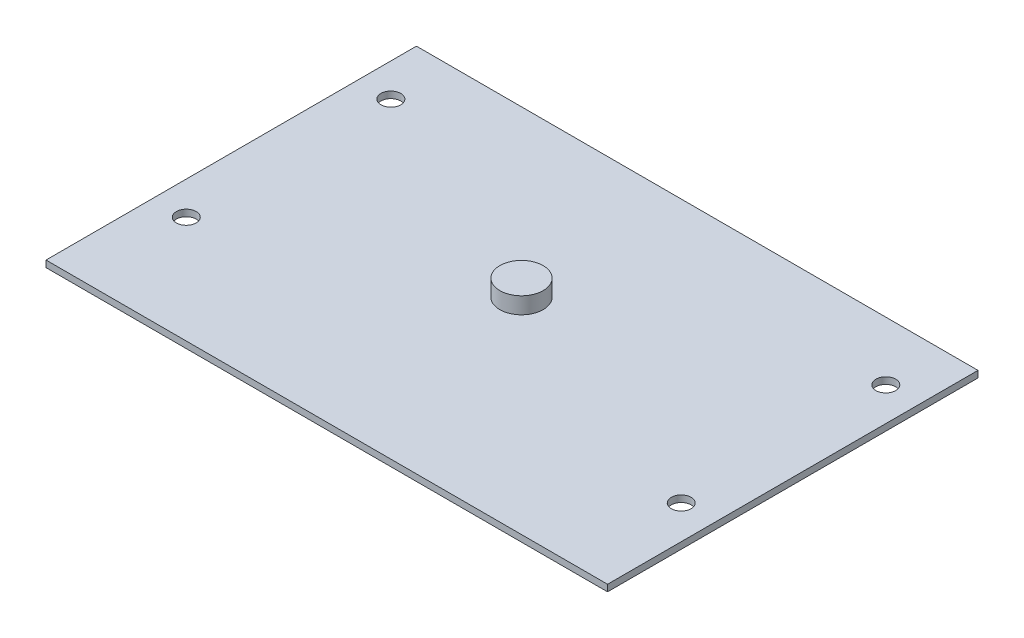
ISO-10303-21;
HEADER;
FILE_DESCRIPTION(('STEP AP214'),'2;1');
FILE_NAME('part.step','',(''),(''),'','','');
FILE_SCHEMA(('AUTOMOTIVE_DESIGN { 1 0 10303 214 1 1 1 1 }'));
ENDSEC;
DATA;
#1=APPLICATION_CONTEXT('core data for automotive mechanical design processes');
#2=APPLICATION_PROTOCOL_DEFINITION('international standard','automotive_design',2000,#1);
#3=PRODUCT_CONTEXT('',#1,'mechanical');
#4=PRODUCT('Part','Part','',(#3));
#5=PRODUCT_RELATED_PRODUCT_CATEGORY('part','',(#4));
#6=PRODUCT_DEFINITION_FORMATION('','',#4);
#7=PRODUCT_DEFINITION_CONTEXT('part definition',#1,'design');
#8=PRODUCT_DEFINITION('design','',#6,#7);
#9=PRODUCT_DEFINITION_SHAPE('','',#8);
#10=(LENGTH_UNIT() NAMED_UNIT(*) SI_UNIT(.MILLI.,.METRE.));
#11=(NAMED_UNIT(*) PLANE_ANGLE_UNIT() SI_UNIT($,.RADIAN.));
#12=(NAMED_UNIT(*) SI_UNIT($,.STERADIAN.) SOLID_ANGLE_UNIT());
#13=UNCERTAINTY_MEASURE_WITH_UNIT(LENGTH_MEASURE(1.E-05),#10,'distance_accuracy_value','');
#14=(GEOMETRIC_REPRESENTATION_CONTEXT(3) GLOBAL_UNCERTAINTY_ASSIGNED_CONTEXT((#13)) GLOBAL_UNIT_ASSIGNED_CONTEXT((#10,
#11,#12)) REPRESENTATION_CONTEXT('',''));
#15=CARTESIAN_POINT('',(0.,0.,0.));
#16=DIRECTION('',(0.,0.,1.));
#17=DIRECTION('',(1.,0.,0.));
#18=AXIS2_PLACEMENT_3D('',#15,#16,#17);
#19=CARTESIAN_POINT('',(0.,1.,0.));
#20=DIRECTION('',(0.,-1.,0.));
#21=DIRECTION('',(0.,0.,-1.));
#22=AXIS2_PLACEMENT_3D('',#19,#20,#21);
#23=PLANE('',#22);
#24=CARTESIAN_POINT('',(40.8981457064996,1.,-31.1545374480886));
#25=DIRECTION('',(0.,-1.,0.));
#26=DIRECTION('',(0.,0.,-1.));
#27=AXIS2_PLACEMENT_3D('',#24,#25,#26);
#28=CIRCLE('',#27,3.28322398725802);
#29=CARTESIAN_POINT('',(40.8981457064996,1.,-34.4377614353466));
#30=VERTEX_POINT('',#29);
#31=EDGE_CURVE('E11',#30,#30,#28,.F.);
#32=ORIENTED_EDGE('',*,*,#31,.F.);
#33=EDGE_LOOP('',(#32));
#34=FACE_BOUND('',#33,.T.);
#35=DIRECTION('',(0.,0.,1.));
#36=VECTOR('',#35,1.);
#37=CARTESIAN_POINT('',(0.,1.,0.));
#38=LINE('',#37,#36);
#39=CARTESIAN_POINT('',(0.,1.,-56.134));
#40=VERTEX_POINT('',#39);
#41=CARTESIAN_POINT('',(0.,1.,0.));
#42=VERTEX_POINT('',#41);
#43=EDGE_CURVE('E91',#40,#42,#38,.T.);
#44=ORIENTED_EDGE('',*,*,#43,.T.);
#45=DIRECTION('',(1.,0.,0.));
#46=VECTOR('',#45,1.);
#47=CARTESIAN_POINT('',(0.,1.,0.));
#48=LINE('',#47,#46);
#49=CARTESIAN_POINT('',(85.09,1.,0.));
#50=VERTEX_POINT('',#49);
#51=EDGE_CURVE('E86',#42,#50,#48,.T.);
#52=ORIENTED_EDGE('',*,*,#51,.T.);
#53=DIRECTION('',(0.,0.,-1.));
#54=VECTOR('',#53,1.);
#55=CARTESIAN_POINT('',(85.09,1.,0.));
#56=LINE('',#55,#54);
#57=CARTESIAN_POINT('',(85.09,1.,-56.134));
#58=VERTEX_POINT('',#57);
#59=EDGE_CURVE('E89',#50,#58,#56,.T.);
#60=ORIENTED_EDGE('',*,*,#59,.T.);
#61=DIRECTION('',(-1.,0.,0.));
#62=VECTOR('',#61,1.);
#63=CARTESIAN_POINT('',(0.,1.,-56.134));
#64=LINE('',#63,#62);
#65=EDGE_CURVE('E55',#58,#40,#64,.T.);
#66=ORIENTED_EDGE('',*,*,#65,.T.);
#67=EDGE_LOOP('',(#44,#52,#60,#66));
#68=FACE_BOUND('',#67,.T.);
#69=CARTESIAN_POINT('',(5.01,1.,-47.244));
#70=DIRECTION('',(0.,1.,0.));
#71=DIRECTION('',(0.,0.,1.));
#72=AXIS2_PLACEMENT_3D('',#69,#70,#71);
#73=CIRCLE('',#72,1.5);
#74=CARTESIAN_POINT('',(5.01,1.,-45.744));
#75=VERTEX_POINT('',#74);
#76=EDGE_CURVE('E108',#75,#75,#73,.T.);
#77=ORIENTED_EDGE('',*,*,#76,.F.);
#78=EDGE_LOOP('',(#77));
#79=FACE_BOUND('',#78,.T.);
#80=CARTESIAN_POINT('',(80.01,1.,-47.244));
#81=DIRECTION('',(0.,1.,0.));
#82=DIRECTION('',(0.,0.,1.));
#83=AXIS2_PLACEMENT_3D('',#80,#81,#82);
#84=CIRCLE('',#83,1.5);
#85=CARTESIAN_POINT('',(80.01,1.,-45.744));
#86=VERTEX_POINT('',#85);
#87=EDGE_CURVE('E143',#86,#86,#84,.T.);
#88=ORIENTED_EDGE('',*,*,#87,.F.);
#89=EDGE_LOOP('',(#88));
#90=FACE_BOUND('',#89,.T.);
#91=CARTESIAN_POINT('',(5.01,1.,-16.244));
#92=DIRECTION('',(0.,1.,0.));
#93=DIRECTION('',(0.,0.,1.));
#94=AXIS2_PLACEMENT_3D('',#91,#92,#93);
#95=CIRCLE('',#94,1.5);
#96=CARTESIAN_POINT('',(5.01,1.,-14.744));
#97=VERTEX_POINT('',#96);
#98=EDGE_CURVE('E138',#97,#97,#95,.T.);
#99=ORIENTED_EDGE('',*,*,#98,.F.);
#100=EDGE_LOOP('',(#99));
#101=FACE_BOUND('',#100,.T.);
#102=CARTESIAN_POINT('',(80.01,1.,-16.244));
#103=DIRECTION('',(0.,1.,0.));
#104=DIRECTION('',(0.,0.,1.));
#105=AXIS2_PLACEMENT_3D('',#102,#103,#104);
#106=CIRCLE('',#105,1.5);
#107=CARTESIAN_POINT('',(80.01,1.,-14.744));
#108=VERTEX_POINT('',#107);
#109=EDGE_CURVE('E129',#108,#108,#106,.T.);
#110=ORIENTED_EDGE('',*,*,#109,.F.);
#111=EDGE_LOOP('',(#110));
#112=FACE_BOUND('',#111,.T.);
#113=ADVANCED_FACE('F38',(#34,#68,#79,#90,#101,#112),#23,.F.);
#114=CARTESIAN_POINT('',(0.,0.,0.));
#115=DIRECTION('',(0.,-1.,0.));
#116=DIRECTION('',(0.,0.,-1.));
#117=AXIS2_PLACEMENT_3D('',#114,#115,#116);
#118=PLANE('',#117);
#119=CARTESIAN_POINT('',(5.01,0.,-16.244));
#120=DIRECTION('',(0.,1.,0.));
#121=DIRECTION('',(0.,0.,1.));
#122=AXIS2_PLACEMENT_3D('',#119,#120,#121);
#123=CIRCLE('',#122,1.5);
#124=CARTESIAN_POINT('',(5.01,0.,-14.744));
#125=VERTEX_POINT('',#124);
#126=EDGE_CURVE('E133',#125,#125,#123,.T.);
#127=ORIENTED_EDGE('',*,*,#126,.T.);
#128=EDGE_LOOP('',(#127));
#129=FACE_BOUND('',#128,.T.);
#130=CARTESIAN_POINT('',(5.01,0.,-47.244));
#131=DIRECTION('',(0.,1.,0.));
#132=DIRECTION('',(0.,0.,1.));
#133=AXIS2_PLACEMENT_3D('',#130,#131,#132);
#134=CIRCLE('',#133,1.5);
#135=CARTESIAN_POINT('',(5.01,0.,-45.744));
#136=VERTEX_POINT('',#135);
#137=EDGE_CURVE('E146',#136,#136,#134,.T.);
#138=ORIENTED_EDGE('',*,*,#137,.T.);
#139=EDGE_LOOP('',(#138));
#140=FACE_BOUND('',#139,.T.);
#141=DIRECTION('',(0.,0.,1.));
#142=VECTOR('',#141,1.);
#143=CARTESIAN_POINT('',(0.,0.,0.));
#144=LINE('',#143,#142);
#145=CARTESIAN_POINT('',(0.,0.,-56.134));
#146=VERTEX_POINT('',#145);
#147=CARTESIAN_POINT('',(0.,0.,0.));
#148=VERTEX_POINT('',#147);
#149=EDGE_CURVE('E105',#146,#148,#144,.T.);
#150=ORIENTED_EDGE('',*,*,#149,.F.);
#151=DIRECTION('',(-1.,0.,0.));
#152=VECTOR('',#151,1.);
#153=CARTESIAN_POINT('',(0.,0.,-56.134));
#154=LINE('',#153,#152);
#155=CARTESIAN_POINT('',(85.09,0.,-56.134));
#156=VERTEX_POINT('',#155);
#157=EDGE_CURVE('E78',#156,#146,#154,.T.);
#158=ORIENTED_EDGE('',*,*,#157,.F.);
#159=DIRECTION('',(0.,0.,-1.));
#160=VECTOR('',#159,1.);
#161=CARTESIAN_POINT('',(85.09,0.,0.));
#162=LINE('',#161,#160);
#163=CARTESIAN_POINT('',(85.09,0.,0.));
#164=VERTEX_POINT('',#163);
#165=EDGE_CURVE('E72',#164,#156,#162,.T.);
#166=ORIENTED_EDGE('',*,*,#165,.F.);
#167=DIRECTION('',(1.,0.,0.));
#168=VECTOR('',#167,1.);
#169=CARTESIAN_POINT('',(0.,0.,0.));
#170=LINE('',#169,#168);
#171=EDGE_CURVE('E96',#148,#164,#170,.T.);
#172=ORIENTED_EDGE('',*,*,#171,.F.);
#173=EDGE_LOOP('',(#150,#158,#166,#172));
#174=FACE_BOUND('',#173,.T.);
#175=CARTESIAN_POINT('',(80.01,0.,-47.244));
#176=DIRECTION('',(0.,1.,0.));
#177=DIRECTION('',(0.,0.,1.));
#178=AXIS2_PLACEMENT_3D('',#175,#176,#177);
#179=CIRCLE('',#178,1.5);
#180=CARTESIAN_POINT('',(80.01,0.,-45.744));
#181=VERTEX_POINT('',#180);
#182=EDGE_CURVE('E124',#181,#181,#179,.T.);
#183=ORIENTED_EDGE('',*,*,#182,.T.);
#184=EDGE_LOOP('',(#183));
#185=FACE_BOUND('',#184,.T.);
#186=CARTESIAN_POINT('',(80.01,0.,-16.244));
#187=DIRECTION('',(0.,1.,0.));
#188=DIRECTION('',(0.,0.,1.));
#189=AXIS2_PLACEMENT_3D('',#186,#187,#188);
#190=CIRCLE('',#189,1.5);
#191=CARTESIAN_POINT('',(80.01,0.,-14.744));
#192=VERTEX_POINT('',#191);
#193=EDGE_CURVE('E127',#192,#192,#190,.T.);
#194=ORIENTED_EDGE('',*,*,#193,.T.);
#195=EDGE_LOOP('',(#194));
#196=FACE_BOUND('',#195,.T.);
#197=ADVANCED_FACE('F116',(#129,#140,#174,#185,#196),#118,.T.);
#198=CARTESIAN_POINT('',(0.,1.,0.));
#199=DIRECTION('',(1.,0.,0.));
#200=DIRECTION('',(0.,0.,-1.));
#201=AXIS2_PLACEMENT_3D('',#198,#199,#200);
#202=PLANE('',#201);
#203=ORIENTED_EDGE('',*,*,#149,.T.);
#204=DIRECTION('',(0.,-1.,0.));
#205=VECTOR('',#204,1.);
#206=CARTESIAN_POINT('',(0.,1.,0.));
#207=LINE('',#206,#205);
#208=EDGE_CURVE('E47',#42,#148,#207,.T.);
#209=ORIENTED_EDGE('',*,*,#208,.F.);
#210=ORIENTED_EDGE('',*,*,#43,.F.);
#211=DIRECTION('',(0.,-1.,0.));
#212=VECTOR('',#211,1.);
#213=CARTESIAN_POINT('',(0.,1.,-56.134));
#214=LINE('',#213,#212);
#215=EDGE_CURVE('E101',#40,#146,#214,.T.);
#216=ORIENTED_EDGE('',*,*,#215,.T.);
#217=EDGE_LOOP('',(#203,#209,#210,#216));
#218=FACE_BOUND('',#217,.T.);
#219=ADVANCED_FACE('F40',(#218),#202,.F.);
#220=CARTESIAN_POINT('',(0.,1.,0.));
#221=DIRECTION('',(0.,0.,-1.));
#222=DIRECTION('',(-1.,0.,0.));
#223=AXIS2_PLACEMENT_3D('',#220,#221,#222);
#224=PLANE('',#223);
#225=ORIENTED_EDGE('',*,*,#171,.T.);
#226=DIRECTION('',(0.,-1.,0.));
#227=VECTOR('',#226,1.);
#228=CARTESIAN_POINT('',(85.09,1.,0.));
#229=LINE('',#228,#227);
#230=EDGE_CURVE('E94',#50,#164,#229,.T.);
#231=ORIENTED_EDGE('',*,*,#230,.F.);
#232=ORIENTED_EDGE('',*,*,#51,.F.);
#233=ORIENTED_EDGE('',*,*,#208,.T.);
#234=EDGE_LOOP('',(#225,#231,#232,#233));
#235=FACE_BOUND('',#234,.T.);
#236=ADVANCED_FACE('F95',(#235),#224,.F.);
#237=CARTESIAN_POINT('',(85.09,1.,0.));
#238=DIRECTION('',(-1.,0.,0.));
#239=DIRECTION('',(0.,0.,1.));
#240=AXIS2_PLACEMENT_3D('',#237,#238,#239);
#241=PLANE('',#240);
#242=ORIENTED_EDGE('',*,*,#165,.T.);
#243=DIRECTION('',(0.,-1.,0.));
#244=VECTOR('',#243,1.);
#245=CARTESIAN_POINT('',(85.09,1.,-56.134));
#246=LINE('',#245,#244);
#247=EDGE_CURVE('E97',#58,#156,#246,.T.);
#248=ORIENTED_EDGE('',*,*,#247,.F.);
#249=ORIENTED_EDGE('',*,*,#59,.F.);
#250=ORIENTED_EDGE('',*,*,#230,.T.);
#251=EDGE_LOOP('',(#242,#248,#249,#250));
#252=FACE_BOUND('',#251,.T.);
#253=ADVANCED_FACE('F99',(#252),#241,.F.);
#254=CARTESIAN_POINT('',(0.,1.,-56.134));
#255=DIRECTION('',(0.,0.,1.));
#256=DIRECTION('',(1.,0.,0.));
#257=AXIS2_PLACEMENT_3D('',#254,#255,#256);
#258=PLANE('',#257);
#259=ORIENTED_EDGE('',*,*,#157,.T.);
#260=ORIENTED_EDGE('',*,*,#215,.F.);
#261=ORIENTED_EDGE('',*,*,#65,.F.);
#262=ORIENTED_EDGE('',*,*,#247,.T.);
#263=EDGE_LOOP('',(#259,#260,#261,#262));
#264=FACE_BOUND('',#263,.T.);
#265=ADVANCED_FACE('F157',(#264),#258,.F.);
#266=CARTESIAN_POINT('',(5.01,1.,-47.244));
#267=DIRECTION('',(0.,-1.,0.));
#268=DIRECTION('',(0.,0.,-1.));
#269=AXIS2_PLACEMENT_3D('',#266,#267,#268);
#270=CYLINDRICAL_SURFACE('',#269,1.5);
#271=ORIENTED_EDGE('',*,*,#76,.T.);
#272=EDGE_LOOP('',(#271));
#273=FACE_BOUND('',#272,.T.);
#274=ORIENTED_EDGE('',*,*,#137,.F.);
#275=EDGE_LOOP('',(#274));
#276=FACE_BOUND('',#275,.T.);
#277=ADVANCED_FACE('F154',(#273,#276),#270,.F.);
#278=CARTESIAN_POINT('',(80.01,1.,-47.244));
#279=DIRECTION('',(0.,-1.,0.));
#280=DIRECTION('',(0.,0.,-1.));
#281=AXIS2_PLACEMENT_3D('',#278,#279,#280);
#282=CYLINDRICAL_SURFACE('',#281,1.5);
#283=ORIENTED_EDGE('',*,*,#87,.T.);
#284=EDGE_LOOP('',(#283));
#285=FACE_BOUND('',#284,.T.);
#286=ORIENTED_EDGE('',*,*,#182,.F.);
#287=EDGE_LOOP('',(#286));
#288=FACE_BOUND('',#287,.T.);
#289=ADVANCED_FACE('F156',(#285,#288),#282,.F.);
#290=CARTESIAN_POINT('',(5.01,1.,-16.244));
#291=DIRECTION('',(0.,-1.,0.));
#292=DIRECTION('',(0.,0.,-1.));
#293=AXIS2_PLACEMENT_3D('',#290,#291,#292);
#294=CYLINDRICAL_SURFACE('',#293,1.5);
#295=ORIENTED_EDGE('',*,*,#98,.T.);
#296=EDGE_LOOP('',(#295));
#297=FACE_BOUND('',#296,.T.);
#298=ORIENTED_EDGE('',*,*,#126,.F.);
#299=EDGE_LOOP('',(#298));
#300=FACE_BOUND('',#299,.T.);
#301=ADVANCED_FACE('F164',(#297,#300),#294,.F.);
#302=CARTESIAN_POINT('',(80.01,1.,-16.244));
#303=DIRECTION('',(0.,-1.,0.));
#304=DIRECTION('',(0.,0.,-1.));
#305=AXIS2_PLACEMENT_3D('',#302,#303,#304);
#306=CYLINDRICAL_SURFACE('',#305,1.5);
#307=ORIENTED_EDGE('',*,*,#109,.T.);
#308=EDGE_LOOP('',(#307));
#309=FACE_BOUND('',#308,.T.);
#310=ORIENTED_EDGE('',*,*,#193,.F.);
#311=EDGE_LOOP('',(#310));
#312=FACE_BOUND('',#311,.T.);
#313=ADVANCED_FACE('F224',(#309,#312),#306,.F.);
#314=CARTESIAN_POINT('',(40.8981457064996,3.5,-31.1545374480886));
#315=DIRECTION('',(0.,-1.,0.));
#316=DIRECTION('',(0.,0.,-1.));
#317=AXIS2_PLACEMENT_3D('',#314,#315,#316);
#318=CYLINDRICAL_SURFACE('',#317,3.28322398725802);
#319=CARTESIAN_POINT('',(40.8981457064996,3.5,-31.1545374480886));
#320=DIRECTION('',(0.,1.,0.));
#321=DIRECTION('',(0.,0.,1.));
#322=AXIS2_PLACEMENT_3D('',#319,#320,#321);
#323=CIRCLE('',#322,3.28322398725802);
#324=CARTESIAN_POINT('',(40.8981457064996,3.5,-27.8713134608306));
#325=VERTEX_POINT('',#324);
#326=EDGE_CURVE('E130',#325,#325,#323,.T.);
#327=ORIENTED_EDGE('',*,*,#326,.F.);
#328=EDGE_LOOP('',(#327));
#329=FACE_BOUND('',#328,.T.);
#330=ORIENTED_EDGE('',*,*,#31,.T.);
#331=EDGE_LOOP('',(#330));
#332=FACE_BOUND('',#331,.T.);
#333=ADVANCED_FACE('F233',(#329,#332),#318,.T.);
#334=CARTESIAN_POINT('',(40.8981457064996,3.5,-31.1545374480886));
#335=DIRECTION('',(0.,1.,0.));
#336=DIRECTION('',(0.,0.,1.));
#337=AXIS2_PLACEMENT_3D('',#334,#335,#336);
#338=PLANE('',#337);
#339=ORIENTED_EDGE('',*,*,#326,.T.);
#340=EDGE_LOOP('',(#339));
#341=FACE_BOUND('',#340,.T.);
#342=ADVANCED_FACE('F242',(#341),#338,.T.);
#343=CLOSED_SHELL('',(#113,#197,#219,#236,#253,#265,#277,#289,#301,#313,#333,#342));
#344=MANIFOLD_SOLID_BREP('B2',#343);
#345=ADVANCED_BREP_SHAPE_REPRESENTATION('',(#18,#344),#14);
#346=SHAPE_DEFINITION_REPRESENTATION(#9,#345);
ENDSEC;
END-ISO-10303-21;
